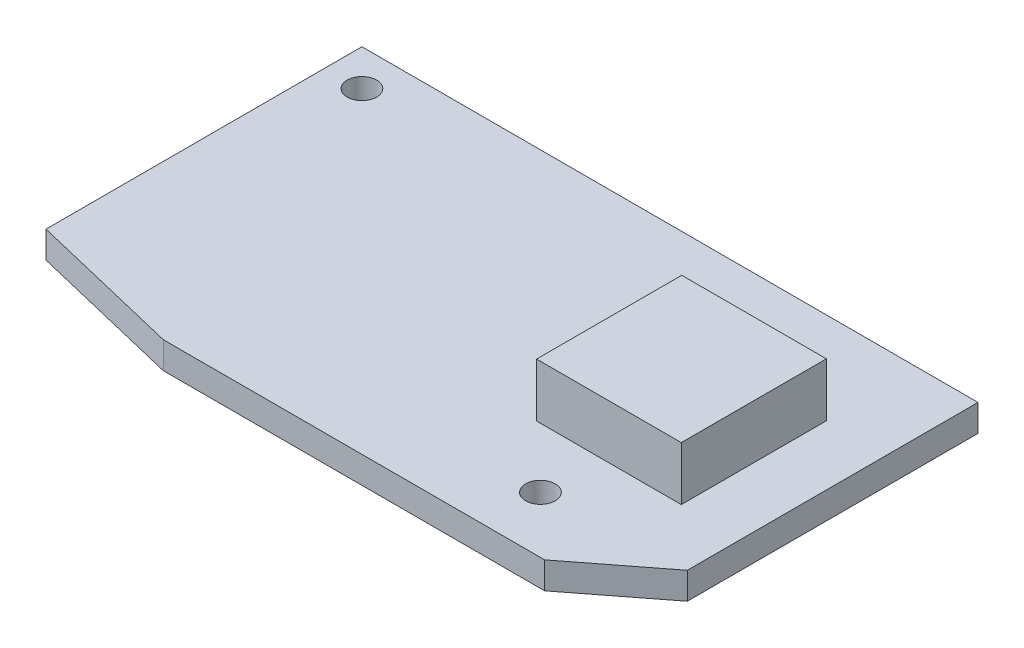
ISO-10303-21;
HEADER;
FILE_DESCRIPTION(('STEP AP214'),'2;1');
FILE_NAME('part.step','',(''),(''),'','','');
FILE_SCHEMA(('AUTOMOTIVE_DESIGN { 1 0 10303 214 1 1 1 1 }'));
ENDSEC;
DATA;
#1=APPLICATION_CONTEXT('core data for automotive mechanical design processes');
#2=APPLICATION_PROTOCOL_DEFINITION('international standard','automotive_design',2000,#1);
#3=PRODUCT_CONTEXT('',#1,'mechanical');
#4=PRODUCT('Part','Part','',(#3));
#5=PRODUCT_RELATED_PRODUCT_CATEGORY('part','',(#4));
#6=PRODUCT_DEFINITION_FORMATION('','',#4);
#7=PRODUCT_DEFINITION_CONTEXT('part definition',#1,'design');
#8=PRODUCT_DEFINITION('design','',#6,#7);
#9=PRODUCT_DEFINITION_SHAPE('','',#8);
#10=(LENGTH_UNIT() NAMED_UNIT(*) SI_UNIT(.MILLI.,.METRE.));
#11=(NAMED_UNIT(*) PLANE_ANGLE_UNIT() SI_UNIT($,.RADIAN.));
#12=(NAMED_UNIT(*) SI_UNIT($,.STERADIAN.) SOLID_ANGLE_UNIT());
#13=UNCERTAINTY_MEASURE_WITH_UNIT(LENGTH_MEASURE(1.E-05),#10,'distance_accuracy_value','');
#14=(GEOMETRIC_REPRESENTATION_CONTEXT(3) GLOBAL_UNCERTAINTY_ASSIGNED_CONTEXT((#13)) GLOBAL_UNIT_ASSIGNED_CONTEXT((#10,
#11,#12)) REPRESENTATION_CONTEXT('',''));
#15=CARTESIAN_POINT('',(0.,0.,0.));
#16=DIRECTION('',(0.,0.,1.));
#17=DIRECTION('',(1.,0.,0.));
#18=AXIS2_PLACEMENT_3D('',#15,#16,#17);
#19=CARTESIAN_POINT('',(0.,2.,0.));
#20=DIRECTION('',(0.,-1.,0.));
#21=DIRECTION('',(0.,0.,-1.));
#22=AXIS2_PLACEMENT_3D('',#19,#20,#21);
#23=PLANE('',#22);
#24=CARTESIAN_POINT('',(2.7,2.,2.7));
#25=DIRECTION('',(0.,1.,0.));
#26=DIRECTION('',(0.,0.,1.));
#27=AXIS2_PLACEMENT_3D('',#24,#25,#26);
#28=CIRCLE('',#27,1.1);
#29=CARTESIAN_POINT('',(2.7,2.,3.8));
#30=VERTEX_POINT('',#29);
#31=EDGE_CURVE('E187',#30,#30,#28,.T.);
#32=ORIENTED_EDGE('',*,*,#31,.F.);
#33=EDGE_LOOP('',(#32));
#34=FACE_BOUND('',#33,.T.);
#35=CARTESIAN_POINT('',(35.4,2.,22.1));
#36=DIRECTION('',(0.,1.,0.));
#37=DIRECTION('',(0.,0.,1.));
#38=AXIS2_PLACEMENT_3D('',#35,#36,#37);
#39=CIRCLE('',#38,1.1);
#40=CARTESIAN_POINT('',(35.4,2.,23.2));
#41=VERTEX_POINT('',#40);
#42=EDGE_CURVE('E192',#41,#41,#39,.T.);
#43=ORIENTED_EDGE('',*,*,#42,.F.);
#44=EDGE_LOOP('',(#43));
#45=FACE_BOUND('',#44,.T.);
#46=DIRECTION('',(0.,0.,1.));
#47=VECTOR('',#46,1.);
#48=CARTESIAN_POINT('',(0.,2.,23.5369565217392));
#49=LINE('',#48,#47);
#50=CARTESIAN_POINT('',(0.,2.,0.));
#51=VERTEX_POINT('',#50);
#52=CARTESIAN_POINT('',(0.,2.,23.5369565217392));
#53=VERTEX_POINT('',#52);
#54=EDGE_CURVE('E150',#51,#53,#49,.T.);
#55=ORIENTED_EDGE('',*,*,#54,.T.);
#56=DIRECTION('',(0.972348928726632,0.,0.233532783146546));
#57=VECTOR('',#56,1.);
#58=CARTESIAN_POINT('',(11.5043478260869,2.,26.3));
#59=LINE('',#58,#57);
#60=CARTESIAN_POINT('',(11.5043478260869,2.,26.3));
#61=VERTEX_POINT('',#60);
#62=EDGE_CURVE('E153',#53,#61,#59,.T.);
#63=ORIENTED_EDGE('',*,*,#62,.T.);
#64=DIRECTION('',(1.,0.,0.));
#65=VECTOR('',#64,1.);
#66=CARTESIAN_POINT('',(39.9130434782609,2.,26.3));
#67=LINE('',#66,#65);
#68=CARTESIAN_POINT('',(39.9130434782609,2.,26.3));
#69=VERTEX_POINT('',#68);
#70=EDGE_CURVE('E156',#61,#69,#67,.T.);
#71=ORIENTED_EDGE('',*,*,#70,.T.);
#72=DIRECTION('',(0.790324727084575,0.,-0.612688196196639));
#73=VECTOR('',#72,1.);
#74=CARTESIAN_POINT('',(39.9130434782609,2.,26.3));
#75=LINE('',#74,#73);
#76=CARTESIAN_POINT('',(45.9,2.,21.658695652174));
#77=VERTEX_POINT('',#76);
#78=EDGE_CURVE('E158',#69,#77,#75,.T.);
#79=ORIENTED_EDGE('',*,*,#78,.T.);
#80=DIRECTION('',(0.,0.,-1.));
#81=VECTOR('',#80,1.);
#82=CARTESIAN_POINT('',(45.9,2.,0.));
#83=LINE('',#82,#81);
#84=CARTESIAN_POINT('',(45.9,2.,0.));
#85=VERTEX_POINT('',#84);
#86=EDGE_CURVE('E160',#77,#85,#83,.T.);
#87=ORIENTED_EDGE('',*,*,#86,.T.);
#88=DIRECTION('',(-1.,0.,0.));
#89=VECTOR('',#88,1.);
#90=CARTESIAN_POINT('',(0.,2.,0.));
#91=LINE('',#90,#89);
#92=EDGE_CURVE('E162',#85,#51,#91,.T.);
#93=ORIENTED_EDGE('',*,*,#92,.T.);
#94=EDGE_LOOP('',(#55,#63,#71,#79,#87,#93));
#95=FACE_BOUND('',#94,.T.);
#96=DIRECTION('',(0.,0.,1.));
#97=VECTOR('',#96,1.);
#98=CARTESIAN_POINT('',(30.6584358486496,2.,6.83292082942618));
#99=LINE('',#98,#97);
#100=CARTESIAN_POINT('',(30.6584358486496,2.,6.83292082942618));
#101=VERTEX_POINT('',#100);
#102=CARTESIAN_POINT('',(30.6584358486496,2.,17.6439221441297));
#103=VERTEX_POINT('',#102);
#104=EDGE_CURVE('E140',#101,#103,#99,.T.);
#105=ORIENTED_EDGE('',*,*,#104,.F.);
#106=DIRECTION('',(-1.,0.,0.));
#107=VECTOR('',#106,1.);
#108=CARTESIAN_POINT('',(30.6584358486496,2.,6.83292082942618));
#109=LINE('',#108,#107);
#110=CARTESIAN_POINT('',(41.4374519523629,2.,6.83292082942618));
#111=VERTEX_POINT('',#110);
#112=EDGE_CURVE('E137',#111,#101,#109,.T.);
#113=ORIENTED_EDGE('',*,*,#112,.F.);
#114=DIRECTION('',(0.,0.,-1.));
#115=VECTOR('',#114,1.);
#116=CARTESIAN_POINT('',(41.4374519523629,2.,6.83292082942618));
#117=LINE('',#116,#115);
#118=CARTESIAN_POINT('',(41.4374519523629,2.,17.6439221441297));
#119=VERTEX_POINT('',#118);
#120=EDGE_CURVE('E63',#119,#111,#117,.T.);
#121=ORIENTED_EDGE('',*,*,#120,.F.);
#122=DIRECTION('',(1.,0.,0.));
#123=VECTOR('',#122,1.);
#124=CARTESIAN_POINT('',(30.6584358486496,2.,17.6439221441297));
#125=LINE('',#124,#123);
#126=EDGE_CURVE('E58',#103,#119,#125,.T.);
#127=ORIENTED_EDGE('',*,*,#126,.F.);
#128=EDGE_LOOP('',(#105,#113,#121,#127));
#129=FACE_BOUND('',#128,.T.);
#130=ADVANCED_FACE('F41',(#34,#45,#95,#129),#23,.F.);
#131=CARTESIAN_POINT('',(0.,2.,23.5369565217392));
#132=DIRECTION('',(1.,0.,0.));
#133=DIRECTION('',(0.,0.,-1.));
#134=AXIS2_PLACEMENT_3D('',#131,#132,#133);
#135=PLANE('',#134);
#136=DIRECTION('',(0.,0.,1.));
#137=VECTOR('',#136,1.);
#138=CARTESIAN_POINT('',(0.,0.,23.5369565217392));
#139=LINE('',#138,#137);
#140=CARTESIAN_POINT('',(0.,0.,0.));
#141=VERTEX_POINT('',#140);
#142=CARTESIAN_POINT('',(0.,0.,23.5369565217392));
#143=VERTEX_POINT('',#142);
#144=EDGE_CURVE('E141',#141,#143,#139,.T.);
#145=ORIENTED_EDGE('',*,*,#144,.T.);
#146=DIRECTION('',(0.,-1.,0.));
#147=VECTOR('',#146,1.);
#148=CARTESIAN_POINT('',(0.,2.,23.5369565217392));
#149=LINE('',#148,#147);
#150=EDGE_CURVE('E11',#53,#143,#149,.T.);
#151=ORIENTED_EDGE('',*,*,#150,.F.);
#152=ORIENTED_EDGE('',*,*,#54,.F.);
#153=DIRECTION('',(0.,-1.,0.));
#154=VECTOR('',#153,1.);
#155=CARTESIAN_POINT('',(0.,2.,0.));
#156=LINE('',#155,#154);
#157=EDGE_CURVE('E163',#51,#141,#156,.T.);
#158=ORIENTED_EDGE('',*,*,#157,.T.);
#159=EDGE_LOOP('',(#145,#151,#152,#158));
#160=FACE_BOUND('',#159,.T.);
#161=ADVANCED_FACE('F43',(#160),#135,.F.);
#162=CARTESIAN_POINT('',(11.5043478260869,2.,26.3));
#163=DIRECTION('',(0.233532783146546,0.,-0.972348928726632));
#164=DIRECTION('',(-0.972348928726632,0.,-0.233532783146546));
#165=AXIS2_PLACEMENT_3D('',#162,#163,#164);
#166=PLANE('',#165);
#167=DIRECTION('',(0.972348928726632,0.,0.233532783146546));
#168=VECTOR('',#167,1.);
#169=CARTESIAN_POINT('',(11.5043478260869,0.,26.3));
#170=LINE('',#169,#168);
#171=CARTESIAN_POINT('',(11.5043478260869,0.,26.3));
#172=VERTEX_POINT('',#171);
#173=EDGE_CURVE('E144',#143,#172,#170,.T.);
#174=ORIENTED_EDGE('',*,*,#173,.T.);
#175=DIRECTION('',(0.,-1.,0.));
#176=VECTOR('',#175,1.);
#177=CARTESIAN_POINT('',(11.5043478260869,2.,26.3));
#178=LINE('',#177,#176);
#179=EDGE_CURVE('E50',#61,#172,#178,.T.);
#180=ORIENTED_EDGE('',*,*,#179,.F.);
#181=ORIENTED_EDGE('',*,*,#62,.F.);
#182=ORIENTED_EDGE('',*,*,#150,.T.);
#183=EDGE_LOOP('',(#174,#180,#181,#182));
#184=FACE_BOUND('',#183,.T.);
#185=ADVANCED_FACE('F229',(#184),#166,.F.);
#186=CARTESIAN_POINT('',(39.9130434782609,2.,26.3));
#187=DIRECTION('',(0.,0.,-1.));
#188=DIRECTION('',(-1.,0.,0.));
#189=AXIS2_PLACEMENT_3D('',#186,#187,#188);
#190=PLANE('',#189);
#191=DIRECTION('',(1.,0.,0.));
#192=VECTOR('',#191,1.);
#193=CARTESIAN_POINT('',(39.9130434782609,0.,26.3));
#194=LINE('',#193,#192);
#195=CARTESIAN_POINT('',(39.9130434782609,0.,26.3));
#196=VERTEX_POINT('',#195);
#197=EDGE_CURVE('E166',#172,#196,#194,.T.);
#198=ORIENTED_EDGE('',*,*,#197,.T.);
#199=DIRECTION('',(0.,-1.,0.));
#200=VECTOR('',#199,1.);
#201=CARTESIAN_POINT('',(39.9130434782609,2.,26.3));
#202=LINE('',#201,#200);
#203=EDGE_CURVE('E181',#69,#196,#202,.T.);
#204=ORIENTED_EDGE('',*,*,#203,.F.);
#205=ORIENTED_EDGE('',*,*,#70,.F.);
#206=ORIENTED_EDGE('',*,*,#179,.T.);
#207=EDGE_LOOP('',(#198,#204,#205,#206));
#208=FACE_BOUND('',#207,.T.);
#209=ADVANCED_FACE('F248',(#208),#190,.F.);
#210=CARTESIAN_POINT('',(39.9130434782609,2.,26.3));
#211=DIRECTION('',(-0.612688196196639,0.,-0.790324727084575));
#212=DIRECTION('',(-0.790324727084575,0.,0.612688196196639));
#213=AXIS2_PLACEMENT_3D('',#210,#211,#212);
#214=PLANE('',#213);
#215=DIRECTION('',(0.790324727084575,0.,-0.612688196196639));
#216=VECTOR('',#215,1.);
#217=CARTESIAN_POINT('',(39.9130434782609,0.,26.3));
#218=LINE('',#217,#216);
#219=CARTESIAN_POINT('',(45.9,0.,21.658695652174));
#220=VERTEX_POINT('',#219);
#221=EDGE_CURVE('E168',#196,#220,#218,.T.);
#222=ORIENTED_EDGE('',*,*,#221,.T.);
#223=DIRECTION('',(0.,-1.,0.));
#224=VECTOR('',#223,1.);
#225=CARTESIAN_POINT('',(45.9,2.,21.658695652174));
#226=LINE('',#225,#224);
#227=EDGE_CURVE('E178',#77,#220,#226,.T.);
#228=ORIENTED_EDGE('',*,*,#227,.F.);
#229=ORIENTED_EDGE('',*,*,#78,.F.);
#230=ORIENTED_EDGE('',*,*,#203,.T.);
#231=EDGE_LOOP('',(#222,#228,#229,#230));
#232=FACE_BOUND('',#231,.T.);
#233=ADVANCED_FACE('F244',(#232),#214,.F.);
#234=CARTESIAN_POINT('',(45.9,2.,0.));
#235=DIRECTION('',(-1.,0.,0.));
#236=DIRECTION('',(0.,0.,1.));
#237=AXIS2_PLACEMENT_3D('',#234,#235,#236);
#238=PLANE('',#237);
#239=DIRECTION('',(0.,0.,-1.));
#240=VECTOR('',#239,1.);
#241=CARTESIAN_POINT('',(45.9,0.,0.));
#242=LINE('',#241,#240);
#243=CARTESIAN_POINT('',(45.9,0.,0.));
#244=VERTEX_POINT('',#243);
#245=EDGE_CURVE('E170',#220,#244,#242,.T.);
#246=ORIENTED_EDGE('',*,*,#245,.T.);
#247=DIRECTION('',(0.,-1.,0.));
#248=VECTOR('',#247,1.);
#249=CARTESIAN_POINT('',(45.9,2.,0.));
#250=LINE('',#249,#248);
#251=EDGE_CURVE('E175',#85,#244,#250,.T.);
#252=ORIENTED_EDGE('',*,*,#251,.F.);
#253=ORIENTED_EDGE('',*,*,#86,.F.);
#254=ORIENTED_EDGE('',*,*,#227,.T.);
#255=EDGE_LOOP('',(#246,#252,#253,#254));
#256=FACE_BOUND('',#255,.T.);
#257=ADVANCED_FACE('F240',(#256),#238,.F.);
#258=CARTESIAN_POINT('',(0.,2.,0.));
#259=DIRECTION('',(0.,0.,1.));
#260=DIRECTION('',(1.,0.,0.));
#261=AXIS2_PLACEMENT_3D('',#258,#259,#260);
#262=PLANE('',#261);
#263=DIRECTION('',(-1.,0.,0.));
#264=VECTOR('',#263,1.);
#265=CARTESIAN_POINT('',(0.,0.,0.));
#266=LINE('',#265,#264);
#267=EDGE_CURVE('E154',#244,#141,#266,.T.);
#268=ORIENTED_EDGE('',*,*,#267,.T.);
#269=ORIENTED_EDGE('',*,*,#157,.F.);
#270=ORIENTED_EDGE('',*,*,#92,.F.);
#271=ORIENTED_EDGE('',*,*,#251,.T.);
#272=EDGE_LOOP('',(#268,#269,#270,#271));
#273=FACE_BOUND('',#272,.T.);
#274=ADVANCED_FACE('F236',(#273),#262,.F.);
#275=CARTESIAN_POINT('',(0.,0.,0.));
#276=DIRECTION('',(0.,-1.,0.));
#277=DIRECTION('',(0.,0.,-1.));
#278=AXIS2_PLACEMENT_3D('',#275,#276,#277);
#279=PLANE('',#278);
#280=CARTESIAN_POINT('',(2.7,0.,2.7));
#281=DIRECTION('',(0.,-1.,0.));
#282=DIRECTION('',(0.,0.,-1.));
#283=AXIS2_PLACEMENT_3D('',#280,#281,#282);
#284=CIRCLE('',#283,1.1);
#285=CARTESIAN_POINT('',(2.7,0.,1.6));
#286=VERTEX_POINT('',#285);
#287=EDGE_CURVE('E45',#286,#286,#284,.T.);
#288=ORIENTED_EDGE('',*,*,#287,.F.);
#289=EDGE_LOOP('',(#288));
#290=FACE_BOUND('',#289,.T.);
#291=CARTESIAN_POINT('',(35.4,0.,22.1));
#292=DIRECTION('',(0.,-1.,0.));
#293=DIRECTION('',(0.,0.,-1.));
#294=AXIS2_PLACEMENT_3D('',#291,#292,#293);
#295=CIRCLE('',#294,1.1);
#296=CARTESIAN_POINT('',(35.4,0.,21.));
#297=VERTEX_POINT('',#296);
#298=EDGE_CURVE('E185',#297,#297,#295,.T.);
#299=ORIENTED_EDGE('',*,*,#298,.F.);
#300=EDGE_LOOP('',(#299));
#301=FACE_BOUND('',#300,.T.);
#302=ORIENTED_EDGE('',*,*,#144,.F.);
#303=ORIENTED_EDGE('',*,*,#267,.F.);
#304=ORIENTED_EDGE('',*,*,#245,.F.);
#305=ORIENTED_EDGE('',*,*,#221,.F.);
#306=ORIENTED_EDGE('',*,*,#197,.F.);
#307=ORIENTED_EDGE('',*,*,#173,.F.);
#308=EDGE_LOOP('',(#302,#303,#304,#305,#306,#307));
#309=FACE_BOUND('',#308,.T.);
#310=ADVANCED_FACE('F234',(#290,#301,#309),#279,.T.);
#311=CARTESIAN_POINT('',(30.6584358486496,6.,6.83292082942618));
#312=DIRECTION('',(1.,0.,0.));
#313=DIRECTION('',(0.,0.,-1.));
#314=AXIS2_PLACEMENT_3D('',#311,#312,#313);
#315=PLANE('',#314);
#316=ORIENTED_EDGE('',*,*,#104,.T.);
#317=DIRECTION('',(0.,-1.,0.));
#318=VECTOR('',#317,1.);
#319=CARTESIAN_POINT('',(30.6584358486496,6.,17.6439221441297));
#320=LINE('',#319,#318);
#321=CARTESIAN_POINT('',(30.6584358486496,6.,17.6439221441297));
#322=VERTEX_POINT('',#321);
#323=EDGE_CURVE('E121',#322,#103,#320,.T.);
#324=ORIENTED_EDGE('',*,*,#323,.F.);
#325=DIRECTION('',(0.,0.,1.));
#326=VECTOR('',#325,1.);
#327=CARTESIAN_POINT('',(30.6584358486496,6.,6.83292082942618));
#328=LINE('',#327,#326);
#329=CARTESIAN_POINT('',(30.6584358486496,6.,6.83292082942618));
#330=VERTEX_POINT('',#329);
#331=EDGE_CURVE('E128',#330,#322,#328,.T.);
#332=ORIENTED_EDGE('',*,*,#331,.F.);
#333=DIRECTION('',(0.,-1.,0.));
#334=VECTOR('',#333,1.);
#335=CARTESIAN_POINT('',(30.6584358486496,6.,6.83292082942618));
#336=LINE('',#335,#334);
#337=EDGE_CURVE('E201',#330,#101,#336,.T.);
#338=ORIENTED_EDGE('',*,*,#337,.T.);
#339=EDGE_LOOP('',(#316,#324,#332,#338));
#340=FACE_BOUND('',#339,.T.);
#341=ADVANCED_FACE('F139',(#340),#315,.F.);
#342=CARTESIAN_POINT('',(30.6584358486496,6.,17.6439221441297));
#343=DIRECTION('',(0.,0.,-1.));
#344=DIRECTION('',(-1.,0.,0.));
#345=AXIS2_PLACEMENT_3D('',#342,#343,#344);
#346=PLANE('',#345);
#347=ORIENTED_EDGE('',*,*,#126,.T.);
#348=DIRECTION('',(0.,-1.,0.));
#349=VECTOR('',#348,1.);
#350=CARTESIAN_POINT('',(41.4374519523629,6.,17.6439221441297));
#351=LINE('',#350,#349);
#352=CARTESIAN_POINT('',(41.4374519523629,6.,17.6439221441297));
#353=VERTEX_POINT('',#352);
#354=EDGE_CURVE('E124',#353,#119,#351,.T.);
#355=ORIENTED_EDGE('',*,*,#354,.F.);
#356=DIRECTION('',(1.,0.,0.));
#357=VECTOR('',#356,1.);
#358=CARTESIAN_POINT('',(30.6584358486496,6.,17.6439221441297));
#359=LINE('',#358,#357);
#360=EDGE_CURVE('E117',#322,#353,#359,.T.);
#361=ORIENTED_EDGE('',*,*,#360,.F.);
#362=ORIENTED_EDGE('',*,*,#323,.T.);
#363=EDGE_LOOP('',(#347,#355,#361,#362));
#364=FACE_BOUND('',#363,.T.);
#365=ADVANCED_FACE('F119',(#364),#346,.F.);
#366=CARTESIAN_POINT('',(41.4374519523629,6.,6.83292082942618));
#367=DIRECTION('',(-1.,0.,0.));
#368=DIRECTION('',(0.,0.,1.));
#369=AXIS2_PLACEMENT_3D('',#366,#367,#368);
#370=PLANE('',#369);
#371=ORIENTED_EDGE('',*,*,#120,.T.);
#372=DIRECTION('',(0.,-1.,0.));
#373=VECTOR('',#372,1.);
#374=CARTESIAN_POINT('',(41.4374519523629,6.,6.83292082942618));
#375=LINE('',#374,#373);
#376=CARTESIAN_POINT('',(41.4374519523629,6.,6.83292082942618));
#377=VERTEX_POINT('',#376);
#378=EDGE_CURVE('E146',#377,#111,#375,.T.);
#379=ORIENTED_EDGE('',*,*,#378,.F.);
#380=DIRECTION('',(0.,0.,-1.));
#381=VECTOR('',#380,1.);
#382=CARTESIAN_POINT('',(41.4374519523629,6.,6.83292082942618));
#383=LINE('',#382,#381);
#384=EDGE_CURVE('E127',#353,#377,#383,.T.);
#385=ORIENTED_EDGE('',*,*,#384,.F.);
#386=ORIENTED_EDGE('',*,*,#354,.T.);
#387=EDGE_LOOP('',(#371,#379,#385,#386));
#388=FACE_BOUND('',#387,.T.);
#389=ADVANCED_FACE('F212',(#388),#370,.F.);
#390=CARTESIAN_POINT('',(30.6584358486496,6.,6.83292082942618));
#391=DIRECTION('',(0.,0.,1.));
#392=DIRECTION('',(1.,0.,0.));
#393=AXIS2_PLACEMENT_3D('',#390,#391,#392);
#394=PLANE('',#393);
#395=ORIENTED_EDGE('',*,*,#112,.T.);
#396=ORIENTED_EDGE('',*,*,#337,.F.);
#397=DIRECTION('',(-1.,0.,0.));
#398=VECTOR('',#397,1.);
#399=CARTESIAN_POINT('',(30.6584358486496,6.,6.83292082942618));
#400=LINE('',#399,#398);
#401=EDGE_CURVE('E133',#377,#330,#400,.T.);
#402=ORIENTED_EDGE('',*,*,#401,.F.);
#403=ORIENTED_EDGE('',*,*,#378,.T.);
#404=EDGE_LOOP('',(#395,#396,#402,#403));
#405=FACE_BOUND('',#404,.T.);
#406=ADVANCED_FACE('F210',(#405),#394,.F.);
#407=CARTESIAN_POINT('',(0.,6.,0.));
#408=DIRECTION('',(0.,1.,0.));
#409=DIRECTION('',(0.,0.,1.));
#410=AXIS2_PLACEMENT_3D('',#407,#408,#409);
#411=PLANE('',#410);
#412=ORIENTED_EDGE('',*,*,#331,.T.);
#413=ORIENTED_EDGE('',*,*,#360,.T.);
#414=ORIENTED_EDGE('',*,*,#384,.T.);
#415=ORIENTED_EDGE('',*,*,#401,.T.);
#416=EDGE_LOOP('',(#412,#413,#414,#415));
#417=FACE_BOUND('',#416,.T.);
#418=ADVANCED_FACE('F131',(#417),#411,.T.);
#419=CARTESIAN_POINT('',(35.4,-2.,22.1));
#420=DIRECTION('',(0.,1.,0.));
#421=DIRECTION('',(0.,0.,1.));
#422=AXIS2_PLACEMENT_3D('',#419,#420,#421);
#423=CYLINDRICAL_SURFACE('',#422,1.1);
#424=ORIENTED_EDGE('',*,*,#298,.T.);
#425=EDGE_LOOP('',(#424));
#426=FACE_BOUND('',#425,.T.);
#427=ORIENTED_EDGE('',*,*,#42,.T.);
#428=EDGE_LOOP('',(#427));
#429=FACE_BOUND('',#428,.T.);
#430=ADVANCED_FACE('F328',(#426,#429),#423,.F.);
#431=CARTESIAN_POINT('',(2.7,-2.,2.7));
#432=DIRECTION('',(0.,1.,0.));
#433=DIRECTION('',(0.,0.,1.));
#434=AXIS2_PLACEMENT_3D('',#431,#432,#433);
#435=CYLINDRICAL_SURFACE('',#434,1.1);
#436=ORIENTED_EDGE('',*,*,#287,.T.);
#437=EDGE_LOOP('',(#436));
#438=FACE_BOUND('',#437,.T.);
#439=ORIENTED_EDGE('',*,*,#31,.T.);
#440=EDGE_LOOP('',(#439));
#441=FACE_BOUND('',#440,.T.);
#442=ADVANCED_FACE('F337',(#438,#441),#435,.F.);
#443=CLOSED_SHELL('',(#130,#161,#185,#209,#233,#257,#274,#310,#341,#365,#389,#406,#418,#430,#442));
#444=MANIFOLD_SOLID_BREP('B2',#443);
#445=ADVANCED_BREP_SHAPE_REPRESENTATION('',(#18,#444),#14);
#446=SHAPE_DEFINITION_REPRESENTATION(#9,#445);
ENDSEC;
END-ISO-10303-21;
